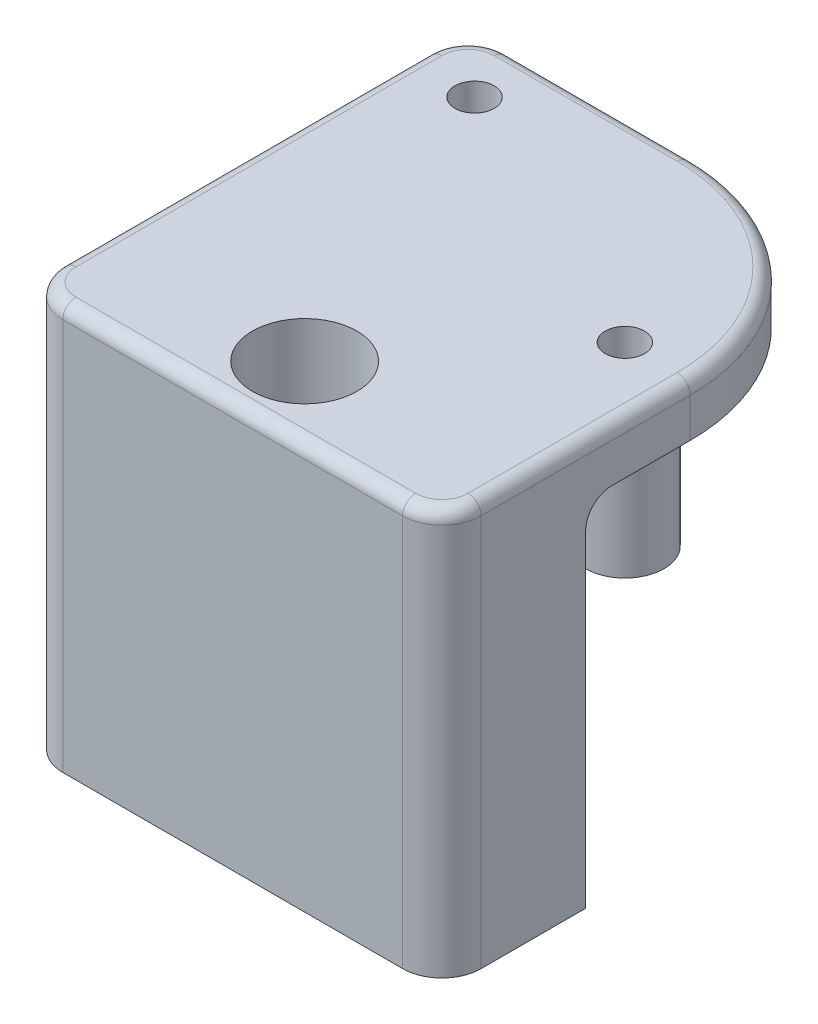
ISO-10303-21;
HEADER;
FILE_DESCRIPTION(('STEP AP214'),'2;1');
FILE_NAME('part.step','',(''),(''),'','','');
FILE_SCHEMA(('AUTOMOTIVE_DESIGN { 1 0 10303 214 1 1 1 1 }'));
ENDSEC;
DATA;
#1=APPLICATION_CONTEXT('core data for automotive mechanical design processes');
#2=APPLICATION_PROTOCOL_DEFINITION('international standard','automotive_design',2000,#1);
#3=PRODUCT_CONTEXT('',#1,'mechanical');
#4=PRODUCT('Part','Part','',(#3));
#5=PRODUCT_RELATED_PRODUCT_CATEGORY('part','',(#4));
#6=PRODUCT_DEFINITION_FORMATION('','',#4);
#7=PRODUCT_DEFINITION_CONTEXT('part definition',#1,'design');
#8=PRODUCT_DEFINITION('design','',#6,#7);
#9=PRODUCT_DEFINITION_SHAPE('','',#8);
#10=(LENGTH_UNIT() NAMED_UNIT(*) SI_UNIT(.MILLI.,.METRE.));
#11=(NAMED_UNIT(*) PLANE_ANGLE_UNIT() SI_UNIT($,.RADIAN.));
#12=(NAMED_UNIT(*) SI_UNIT($,.STERADIAN.) SOLID_ANGLE_UNIT());
#13=UNCERTAINTY_MEASURE_WITH_UNIT(LENGTH_MEASURE(1.E-05),#10,'distance_accuracy_value','');
#14=(GEOMETRIC_REPRESENTATION_CONTEXT(3) GLOBAL_UNCERTAINTY_ASSIGNED_CONTEXT((#13)) GLOBAL_UNIT_ASSIGNED_CONTEXT((#10,
#11,#12)) REPRESENTATION_CONTEXT('',''));
#15=CARTESIAN_POINT('',(0.,0.,0.));
#16=DIRECTION('',(0.,0.,1.));
#17=DIRECTION('',(1.,0.,0.));
#18=AXIS2_PLACEMENT_3D('',#15,#16,#17);
#19=CARTESIAN_POINT('',(17.,27.,-19.));
#20=DIRECTION('',(0.,-1.,0.));
#21=DIRECTION('',(0.,0.,-1.));
#22=AXIS2_PLACEMENT_3D('',#19,#20,#21);
#23=PLANE('',#22);
#24=DIRECTION('',(0.,0.,-1.));
#25=VECTOR('',#24,1.);
#26=CARTESIAN_POINT('',(32.,27.,0.));
#27=LINE('',#26,#25);
#28=CARTESIAN_POINT('',(32.,27.,-13.));
#29=VERTEX_POINT('',#28);
#30=CARTESIAN_POINT('',(32.,27.,-18.9999999999999));
#31=VERTEX_POINT('',#30);
#32=EDGE_CURVE('E195',#29,#31,#27,.T.);
#33=ORIENTED_EDGE('',*,*,#32,.F.);
#34=DIRECTION('',(-1.,0.,0.));
#35=VECTOR('',#34,1.);
#36=CARTESIAN_POINT('',(17.,27.,-13.));
#37=LINE('',#36,#35);
#38=CARTESIAN_POINT('',(0.,27.,-13.));
#39=VERTEX_POINT('',#38);
#40=EDGE_CURVE('E248',#29,#39,#37,.T.);
#41=ORIENTED_EDGE('',*,*,#40,.T.);
#42=DIRECTION('',(0.,0.,1.));
#43=VECTOR('',#42,1.);
#44=CARTESIAN_POINT('',(0.,27.,0.));
#45=LINE('',#44,#43);
#46=CARTESIAN_POINT('',(0.,27.,-31.));
#47=VERTEX_POINT('',#46);
#48=EDGE_CURVE('E191',#47,#39,#45,.T.);
#49=ORIENTED_EDGE('',*,*,#48,.F.);
#50=CARTESIAN_POINT('',(3.,27.,-31.));
#51=DIRECTION('',(0.,1.,0.));
#52=DIRECTION('',(0.,0.,1.));
#53=AXIS2_PLACEMENT_3D('',#50,#51,#52);
#54=CIRCLE('',#53,3.);
#55=CARTESIAN_POINT('',(3.,27.,-34.));
#56=VERTEX_POINT('',#55);
#57=EDGE_CURVE('E173',#56,#47,#54,.T.);
#58=ORIENTED_EDGE('',*,*,#57,.F.);
#59=DIRECTION('',(-1.,0.,0.));
#60=VECTOR('',#59,1.);
#61=CARTESIAN_POINT('',(16.9999999999999,27.,-34.));
#62=LINE('',#61,#60);
#63=CARTESIAN_POINT('',(16.9999999999999,27.,-34.));
#64=VERTEX_POINT('',#63);
#65=EDGE_CURVE('E155',#64,#56,#62,.T.);
#66=ORIENTED_EDGE('',*,*,#65,.F.);
#67=CARTESIAN_POINT('',(17.,27.,-19.));
#68=DIRECTION('',(0.,1.,0.));
#69=DIRECTION('',(0.,0.,-1.));
#70=AXIS2_PLACEMENT_3D('',#67,#68,#69);
#71=CIRCLE('',#70,15.);
#72=EDGE_CURVE('E170',#31,#64,#71,.T.);
#73=ORIENTED_EDGE('',*,*,#72,.F.);
#74=EDGE_LOOP('',(#33,#41,#49,#58,#66,#73));
#75=FACE_BOUND('',#74,.T.);
#76=CARTESIAN_POINT('',(5.,27.,-29.5));
#77=DIRECTION('',(0.,1.,0.));
#78=DIRECTION('',(0.,0.,1.));
#79=AXIS2_PLACEMENT_3D('',#76,#77,#78);
#80=CIRCLE('',#79,1.5);
#81=CARTESIAN_POINT('',(5.,27.,-28.));
#82=VERTEX_POINT('',#81);
#83=EDGE_CURVE('E185',#82,#82,#80,.T.);
#84=ORIENTED_EDGE('',*,*,#83,.T.);
#85=EDGE_LOOP('',(#84));
#86=FACE_BOUND('',#85,.T.);
#87=CARTESIAN_POINT('',(27.,27.,-19.));
#88=DIRECTION('',(0.,-1.,0.));
#89=DIRECTION('',(0.,0.,-1.));
#90=AXIS2_PLACEMENT_3D('',#87,#88,#89);
#91=CIRCLE('',#90,3.);
#92=CARTESIAN_POINT('',(27.,27.,-22.));
#93=VERTEX_POINT('',#92);
#94=EDGE_CURVE('E351',#93,#93,#91,.T.);
#95=ORIENTED_EDGE('',*,*,#94,.F.);
#96=EDGE_LOOP('',(#95));
#97=FACE_BOUND('',#96,.T.);
#98=ADVANCED_FACE('F41',(#75,#86,#97),#23,.T.);
#99=CARTESIAN_POINT('',(0.,0.,0.));
#100=DIRECTION('',(0.,-1.,0.));
#101=DIRECTION('',(0.,0.,-1.));
#102=AXIS2_PLACEMENT_3D('',#99,#100,#101);
#103=PLANE('',#102);
#104=DIRECTION('',(1.,0.,0.));
#105=VECTOR('',#104,1.);
#106=CARTESIAN_POINT('',(0.,0.,0.));
#107=LINE('',#106,#105);
#108=CARTESIAN_POINT('',(3.,0.,0.));
#109=VERTEX_POINT('',#108);
#110=CARTESIAN_POINT('',(29.,0.,0.));
#111=VERTEX_POINT('',#110);
#112=EDGE_CURVE('E212',#109,#111,#107,.T.);
#113=ORIENTED_EDGE('',*,*,#112,.F.);
#114=CARTESIAN_POINT('',(3.,0.,-3.));
#115=DIRECTION('',(0.,-1.,0.));
#116=DIRECTION('',(0.,0.,-1.));
#117=AXIS2_PLACEMENT_3D('',#114,#115,#116);
#118=CIRCLE('',#117,3.);
#119=CARTESIAN_POINT('',(0.,0.,-3.));
#120=VERTEX_POINT('',#119);
#121=EDGE_CURVE('E242',#109,#120,#118,.T.);
#122=ORIENTED_EDGE('',*,*,#121,.T.);
#123=DIRECTION('',(0.,0.,1.));
#124=VECTOR('',#123,1.);
#125=CARTESIAN_POINT('',(0.,0.,0.));
#126=LINE('',#125,#124);
#127=CARTESIAN_POINT('',(0.,0.,-11.));
#128=VERTEX_POINT('',#127);
#129=EDGE_CURVE('E208',#128,#120,#126,.T.);
#130=ORIENTED_EDGE('',*,*,#129,.F.);
#131=DIRECTION('',(-1.,0.,0.));
#132=VECTOR('',#131,1.);
#133=CARTESIAN_POINT('',(0.,0.,-11.));
#134=LINE('',#133,#132);
#135=CARTESIAN_POINT('',(32.,0.,-11.));
#136=VERTEX_POINT('',#135);
#137=EDGE_CURVE('E219',#136,#128,#134,.T.);
#138=ORIENTED_EDGE('',*,*,#137,.F.);
#139=DIRECTION('',(0.,0.,-1.));
#140=VECTOR('',#139,1.);
#141=CARTESIAN_POINT('',(32.,0.,0.));
#142=LINE('',#141,#140);
#143=CARTESIAN_POINT('',(32.,0.,-3.));
#144=VERTEX_POINT('',#143);
#145=EDGE_CURVE('E215',#144,#136,#142,.T.);
#146=ORIENTED_EDGE('',*,*,#145,.F.);
#147=CARTESIAN_POINT('',(29.,0.,-3.));
#148=DIRECTION('',(0.,-1.,0.));
#149=DIRECTION('',(0.,0.,-1.));
#150=AXIS2_PLACEMENT_3D('',#147,#148,#149);
#151=CIRCLE('',#150,3.);
#152=EDGE_CURVE('E232',#144,#111,#151,.T.);
#153=ORIENTED_EDGE('',*,*,#152,.T.);
#154=EDGE_LOOP('',(#113,#122,#130,#138,#146,#153));
#155=FACE_BOUND('',#154,.T.);
#156=CARTESIAN_POINT('',(16.,0.,-5.50000000000001));
#157=DIRECTION('',(0.,1.,0.));
#158=DIRECTION('',(0.,0.,1.));
#159=AXIS2_PLACEMENT_3D('',#156,#157,#158);
#160=CIRCLE('',#159,1.6);
#161=CARTESIAN_POINT('',(16.,0.,-3.9));
#162=VERTEX_POINT('',#161);
#163=EDGE_CURVE('E163',#162,#162,#160,.T.);
#164=ORIENTED_EDGE('',*,*,#163,.T.);
#165=EDGE_LOOP('',(#164));
#166=FACE_BOUND('',#165,.T.);
#167=ADVANCED_FACE('F391',(#155,#166),#103,.T.);
#168=CARTESIAN_POINT('',(0.,27.,0.));
#169=DIRECTION('',(1.,0.,0.));
#170=DIRECTION('',(0.,0.,-1.));
#171=AXIS2_PLACEMENT_3D('',#168,#169,#170);
#172=PLANE('',#171);
#173=DIRECTION('',(0.,-1.,0.));
#174=VECTOR('',#173,1.);
#175=CARTESIAN_POINT('',(0.,27.,-3.));
#176=LINE('',#175,#174);
#177=CARTESIAN_POINT('',(0.,30.,-3.));
#178=VERTEX_POINT('',#177);
#179=EDGE_CURVE('E245',#120,#178,#176,.F.);
#180=ORIENTED_EDGE('',*,*,#179,.T.);
#181=DIRECTION('',(0.,0.,1.));
#182=VECTOR('',#181,1.);
#183=CARTESIAN_POINT('',(0.,30.,0.));
#184=LINE('',#183,#182);
#185=CARTESIAN_POINT('',(0.,30.,-31.));
#186=VERTEX_POINT('',#185);
#187=EDGE_CURVE('E11',#178,#186,#184,.F.);
#188=ORIENTED_EDGE('',*,*,#187,.T.);
#189=DIRECTION('',(0.,-1.,0.));
#190=VECTOR('',#189,1.);
#191=CARTESIAN_POINT('',(0.,31.,-31.));
#192=LINE('',#191,#190);
#193=EDGE_CURVE('E200',#186,#47,#192,.T.);
#194=ORIENTED_EDGE('',*,*,#193,.T.);
#195=ORIENTED_EDGE('',*,*,#48,.T.);
#196=CARTESIAN_POINT('',(0.,25.,-13.));
#197=DIRECTION('',(1.,0.,0.));
#198=DIRECTION('',(0.,0.,-1.));
#199=AXIS2_PLACEMENT_3D('',#196,#197,#198);
#200=CIRCLE('',#199,2.);
#201=CARTESIAN_POINT('',(0.,25.,-11.));
#202=VERTEX_POINT('',#201);
#203=EDGE_CURVE('E265',#39,#202,#200,.T.);
#204=ORIENTED_EDGE('',*,*,#203,.T.);
#205=DIRECTION('',(0.,-1.,0.));
#206=VECTOR('',#205,1.);
#207=CARTESIAN_POINT('',(0.,27.,-11.));
#208=LINE('',#207,#206);
#209=EDGE_CURVE('E223',#202,#128,#208,.T.);
#210=ORIENTED_EDGE('',*,*,#209,.T.);
#211=ORIENTED_EDGE('',*,*,#129,.T.);
#212=EDGE_LOOP('',(#180,#188,#194,#195,#204,#210,#211));
#213=FACE_BOUND('',#212,.T.);
#214=ADVANCED_FACE('F396',(#213),#172,.F.);
#215=CARTESIAN_POINT('',(0.,27.,0.));
#216=DIRECTION('',(0.,0.,-1.));
#217=DIRECTION('',(-1.,0.,0.));
#218=AXIS2_PLACEMENT_3D('',#215,#216,#217);
#219=PLANE('',#218);
#220=DIRECTION('',(0.,-1.,0.));
#221=VECTOR('',#220,1.);
#222=CARTESIAN_POINT('',(29.,27.,0.));
#223=LINE('',#222,#221);
#224=CARTESIAN_POINT('',(29.,30.,0.));
#225=VERTEX_POINT('',#224);
#226=EDGE_CURVE('E236',#111,#225,#223,.F.);
#227=ORIENTED_EDGE('',*,*,#226,.T.);
#228=DIRECTION('',(1.,0.,0.));
#229=VECTOR('',#228,1.);
#230=CARTESIAN_POINT('',(0.,30.,0.));
#231=LINE('',#230,#229);
#232=CARTESIAN_POINT('',(3.,30.,0.));
#233=VERTEX_POINT('',#232);
#234=EDGE_CURVE('E66',#225,#233,#231,.F.);
#235=ORIENTED_EDGE('',*,*,#234,.T.);
#236=DIRECTION('',(0.,-1.,0.));
#237=VECTOR('',#236,1.);
#238=CARTESIAN_POINT('',(3.,27.,0.));
#239=LINE('',#238,#237);
#240=EDGE_CURVE('E239',#233,#109,#239,.T.);
#241=ORIENTED_EDGE('',*,*,#240,.T.);
#242=ORIENTED_EDGE('',*,*,#112,.T.);
#243=EDGE_LOOP('',(#227,#235,#241,#242));
#244=FACE_BOUND('',#243,.T.);
#245=ADVANCED_FACE('F416',(#244),#219,.F.);
#246=CARTESIAN_POINT('',(32.,27.,0.));
#247=DIRECTION('',(-1.,0.,0.));
#248=DIRECTION('',(0.,0.,1.));
#249=AXIS2_PLACEMENT_3D('',#246,#247,#248);
#250=PLANE('',#249);
#251=DIRECTION('',(0.,-1.,0.));
#252=VECTOR('',#251,1.);
#253=CARTESIAN_POINT('',(32.,31.,-18.9999999999999));
#254=LINE('',#253,#252);
#255=CARTESIAN_POINT('',(32.,30.,-18.9999999999999));
#256=VERTEX_POINT('',#255);
#257=EDGE_CURVE('E178',#256,#31,#254,.T.);
#258=ORIENTED_EDGE('',*,*,#257,.F.);
#259=DIRECTION('',(0.,0.,-1.));
#260=VECTOR('',#259,1.);
#261=CARTESIAN_POINT('',(32.,30.,0.));
#262=LINE('',#261,#260);
#263=CARTESIAN_POINT('',(32.,30.,-3.));
#264=VERTEX_POINT('',#263);
#265=EDGE_CURVE('E305',#256,#264,#262,.F.);
#266=ORIENTED_EDGE('',*,*,#265,.T.);
#267=DIRECTION('',(0.,-1.,0.));
#268=VECTOR('',#267,1.);
#269=CARTESIAN_POINT('',(32.,27.,-3.));
#270=LINE('',#269,#268);
#271=EDGE_CURVE('E229',#264,#144,#270,.T.);
#272=ORIENTED_EDGE('',*,*,#271,.T.);
#273=ORIENTED_EDGE('',*,*,#145,.T.);
#274=DIRECTION('',(0.,-1.,0.));
#275=VECTOR('',#274,1.);
#276=CARTESIAN_POINT('',(32.,27.,-11.));
#277=LINE('',#276,#275);
#278=CARTESIAN_POINT('',(32.,25.,-11.));
#279=VERTEX_POINT('',#278);
#280=EDGE_CURVE('E226',#279,#136,#277,.T.);
#281=ORIENTED_EDGE('',*,*,#280,.F.);
#282=CARTESIAN_POINT('',(32.,25.,-13.));
#283=DIRECTION('',(-1.,0.,0.));
#284=DIRECTION('',(0.,0.,1.));
#285=AXIS2_PLACEMENT_3D('',#282,#283,#284);
#286=CIRCLE('',#285,2.);
#287=EDGE_CURVE('E268',#279,#29,#286,.T.);
#288=ORIENTED_EDGE('',*,*,#287,.T.);
#289=ORIENTED_EDGE('',*,*,#32,.T.);
#290=EDGE_LOOP('',(#258,#266,#272,#273,#281,#288,#289));
#291=FACE_BOUND('',#290,.T.);
#292=ADVANCED_FACE('F412',(#291),#250,.F.);
#293=CARTESIAN_POINT('',(0.,27.,-11.));
#294=DIRECTION('',(0.,0.,1.));
#295=DIRECTION('',(1.,0.,0.));
#296=AXIS2_PLACEMENT_3D('',#293,#294,#295);
#297=PLANE('',#296);
#298=ORIENTED_EDGE('',*,*,#209,.F.);
#299=DIRECTION('',(-1.,0.,0.));
#300=VECTOR('',#299,1.);
#301=CARTESIAN_POINT('',(0.,25.,-11.));
#302=LINE('',#301,#300);
#303=EDGE_CURVE('E262',#202,#279,#302,.F.);
#304=ORIENTED_EDGE('',*,*,#303,.T.);
#305=ORIENTED_EDGE('',*,*,#280,.T.);
#306=ORIENTED_EDGE('',*,*,#137,.T.);
#307=EDGE_LOOP('',(#298,#304,#305,#306));
#308=FACE_BOUND('',#307,.T.);
#309=ADVANCED_FACE('F407',(#308),#297,.F.);
#310=CARTESIAN_POINT('',(16.,27.,-5.50000000000001));
#311=DIRECTION('',(0.,-1.,0.));
#312=DIRECTION('',(0.,0.,-1.));
#313=AXIS2_PLACEMENT_3D('',#310,#311,#312);
#314=CYLINDRICAL_SURFACE('',#313,1.6);
#315=CARTESIAN_POINT('',(16.,17.,-5.50000000000001));
#316=DIRECTION('',(0.,-1.,0.));
#317=DIRECTION('',(0.,0.,-1.));
#318=AXIS2_PLACEMENT_3D('',#315,#316,#317);
#319=CIRCLE('',#318,1.6);
#320=CARTESIAN_POINT('',(16.,17.,-7.10000000000001));
#321=VERTEX_POINT('',#320);
#322=EDGE_CURVE('E253',#321,#321,#319,.T.);
#323=ORIENTED_EDGE('',*,*,#322,.F.);
#324=EDGE_LOOP('',(#323));
#325=FACE_BOUND('',#324,.T.);
#326=ORIENTED_EDGE('',*,*,#163,.F.);
#327=EDGE_LOOP('',(#326));
#328=FACE_BOUND('',#327,.T.);
#329=ADVANCED_FACE('F405',(#325,#328),#314,.F.);
#330=CARTESIAN_POINT('',(17.,31.,-19.));
#331=DIRECTION('',(0.,-1.,0.));
#332=DIRECTION('',(0.,0.,-1.));
#333=AXIS2_PLACEMENT_3D('',#330,#331,#332);
#334=PLANE('',#333);
#335=DIRECTION('',(-1.,0.,0.));
#336=VECTOR('',#335,1.);
#337=CARTESIAN_POINT('',(17.,31.,-33.));
#338=LINE('',#337,#336);
#339=CARTESIAN_POINT('',(16.9999999999999,31.,-33.));
#340=VERTEX_POINT('',#339);
#341=CARTESIAN_POINT('',(3.,31.,-33.));
#342=VERTEX_POINT('',#341);
#343=EDGE_CURVE('E289',#340,#342,#338,.T.);
#344=ORIENTED_EDGE('',*,*,#343,.T.);
#345=CARTESIAN_POINT('',(3.,31.,-31.));
#346=DIRECTION('',(0.,-1.,0.));
#347=DIRECTION('',(0.,0.,-1.));
#348=AXIS2_PLACEMENT_3D('',#345,#346,#347);
#349=CIRCLE('',#348,2.);
#350=CARTESIAN_POINT('',(1.,31.,-31.));
#351=VERTEX_POINT('',#350);
#352=EDGE_CURVE('E292',#342,#351,#349,.F.);
#353=ORIENTED_EDGE('',*,*,#352,.T.);
#354=DIRECTION('',(0.,0.,1.));
#355=VECTOR('',#354,1.);
#356=CARTESIAN_POINT('',(1.,31.,-19.));
#357=LINE('',#356,#355);
#358=CARTESIAN_POINT('',(1.,31.,-3.));
#359=VERTEX_POINT('',#358);
#360=EDGE_CURVE('E271',#351,#359,#357,.T.);
#361=ORIENTED_EDGE('',*,*,#360,.T.);
#362=CARTESIAN_POINT('',(3.,31.,-3.));
#363=DIRECTION('',(0.,-1.,0.));
#364=DIRECTION('',(0.,0.,-1.));
#365=AXIS2_PLACEMENT_3D('',#362,#363,#364);
#366=CIRCLE('',#365,2.);
#367=CARTESIAN_POINT('',(3.,31.,-1.));
#368=VERTEX_POINT('',#367);
#369=EDGE_CURVE('E274',#359,#368,#366,.F.);
#370=ORIENTED_EDGE('',*,*,#369,.T.);
#371=DIRECTION('',(1.,0.,0.));
#372=VECTOR('',#371,1.);
#373=CARTESIAN_POINT('',(17.,31.,-1.));
#374=LINE('',#373,#372);
#375=CARTESIAN_POINT('',(29.,31.,-1.00000000000001));
#376=VERTEX_POINT('',#375);
#377=EDGE_CURVE('E277',#368,#376,#374,.T.);
#378=ORIENTED_EDGE('',*,*,#377,.T.);
#379=CARTESIAN_POINT('',(29.,31.,-3.));
#380=DIRECTION('',(0.,-1.,0.));
#381=DIRECTION('',(0.,0.,-1.));
#382=AXIS2_PLACEMENT_3D('',#379,#380,#381);
#383=CIRCLE('',#382,2.);
#384=CARTESIAN_POINT('',(31.,31.,-3.));
#385=VERTEX_POINT('',#384);
#386=EDGE_CURVE('E280',#376,#385,#383,.F.);
#387=ORIENTED_EDGE('',*,*,#386,.T.);
#388=DIRECTION('',(0.,0.,-1.));
#389=VECTOR('',#388,1.);
#390=CARTESIAN_POINT('',(31.,31.,-19.));
#391=LINE('',#390,#389);
#392=CARTESIAN_POINT('',(31.,31.,-18.9999999999999));
#393=VERTEX_POINT('',#392);
#394=EDGE_CURVE('E283',#385,#393,#391,.T.);
#395=ORIENTED_EDGE('',*,*,#394,.T.);
#396=CARTESIAN_POINT('',(17.,31.,-19.));
#397=DIRECTION('',(0.,-1.,0.));
#398=DIRECTION('',(0.,0.,-1.));
#399=AXIS2_PLACEMENT_3D('',#396,#397,#398);
#400=CIRCLE('',#399,14.);
#401=EDGE_CURVE('E286',#393,#340,#400,.F.);
#402=ORIENTED_EDGE('',*,*,#401,.T.);
#403=EDGE_LOOP('',(#344,#353,#361,#370,#378,#387,#395,#402));
#404=FACE_BOUND('',#403,.T.);
#405=CARTESIAN_POINT('',(16.,31.,-5.50000000000001));
#406=DIRECTION('',(0.,-1.,0.));
#407=DIRECTION('',(0.,0.,-1.));
#408=AXIS2_PLACEMENT_3D('',#405,#406,#407);
#409=CIRCLE('',#408,4.);
#410=CARTESIAN_POINT('',(16.,31.,-9.50000000000001));
#411=VERTEX_POINT('',#410);
#412=EDGE_CURVE('E249',#411,#411,#409,.T.);
#413=ORIENTED_EDGE('',*,*,#412,.T.);
#414=EDGE_LOOP('',(#413));
#415=FACE_BOUND('',#414,.T.);
#416=CARTESIAN_POINT('',(5.,31.,-29.5));
#417=DIRECTION('',(0.,1.,0.));
#418=DIRECTION('',(0.,0.,1.));
#419=AXIS2_PLACEMENT_3D('',#416,#417,#418);
#420=CIRCLE('',#419,1.5);
#421=CARTESIAN_POINT('',(5.,31.,-28.));
#422=VERTEX_POINT('',#421);
#423=EDGE_CURVE('E181',#422,#422,#420,.T.);
#424=ORIENTED_EDGE('',*,*,#423,.F.);
#425=EDGE_LOOP('',(#424));
#426=FACE_BOUND('',#425,.T.);
#427=CARTESIAN_POINT('',(27.,31.,-19.));
#428=DIRECTION('',(0.,1.,0.));
#429=DIRECTION('',(0.,0.,1.));
#430=AXIS2_PLACEMENT_3D('',#427,#428,#429);
#431=CIRCLE('',#430,1.5);
#432=CARTESIAN_POINT('',(27.,31.,-17.5));
#433=VERTEX_POINT('',#432);
#434=EDGE_CURVE('E258',#433,#433,#431,.T.);
#435=ORIENTED_EDGE('',*,*,#434,.F.);
#436=EDGE_LOOP('',(#435));
#437=FACE_BOUND('',#436,.T.);
#438=ADVANCED_FACE('F399',(#404,#415,#426,#437),#334,.F.);
#439=CARTESIAN_POINT('',(17.,31.,-19.));
#440=DIRECTION('',(0.,-1.,0.));
#441=DIRECTION('',(0.,0.,-1.));
#442=AXIS2_PLACEMENT_3D('',#439,#440,#441);
#443=CYLINDRICAL_SURFACE('',#442,15.);
#444=DIRECTION('',(0.,-1.,0.));
#445=VECTOR('',#444,1.);
#446=CARTESIAN_POINT('',(16.9999999999999,31.,-34.));
#447=LINE('',#446,#445);
#448=CARTESIAN_POINT('',(16.9999999999999,30.,-34.));
#449=VERTEX_POINT('',#448);
#450=EDGE_CURVE('E151',#449,#64,#447,.T.);
#451=ORIENTED_EDGE('',*,*,#450,.F.);
#452=CARTESIAN_POINT('',(17.,30.,-19.));
#453=DIRECTION('',(0.,-1.,0.));
#454=DIRECTION('',(0.,0.,-1.));
#455=AXIS2_PLACEMENT_3D('',#452,#453,#454);
#456=CIRCLE('',#455,15.);
#457=EDGE_CURVE('E302',#449,#256,#456,.T.);
#458=ORIENTED_EDGE('',*,*,#457,.T.);
#459=ORIENTED_EDGE('',*,*,#257,.T.);
#460=ORIENTED_EDGE('',*,*,#72,.T.);
#461=EDGE_LOOP('',(#451,#458,#459,#460));
#462=FACE_BOUND('',#461,.T.);
#463=ADVANCED_FACE('F176',(#462),#443,.T.);
#464=CARTESIAN_POINT('',(16.9999999999999,31.,-34.));
#465=DIRECTION('',(0.,0.,1.));
#466=DIRECTION('',(1.,0.,0.));
#467=AXIS2_PLACEMENT_3D('',#464,#465,#466);
#468=PLANE('',#467);
#469=DIRECTION('',(0.,-1.,0.));
#470=VECTOR('',#469,1.);
#471=CARTESIAN_POINT('',(3.,31.,-34.));
#472=LINE('',#471,#470);
#473=CARTESIAN_POINT('',(3.,30.,-34.));
#474=VERTEX_POINT('',#473);
#475=EDGE_CURVE('E164',#474,#56,#472,.T.);
#476=ORIENTED_EDGE('',*,*,#475,.F.);
#477=DIRECTION('',(-1.,0.,0.));
#478=VECTOR('',#477,1.);
#479=CARTESIAN_POINT('',(16.9999999999999,30.,-34.));
#480=LINE('',#479,#478);
#481=EDGE_CURVE('E158',#474,#449,#480,.F.);
#482=ORIENTED_EDGE('',*,*,#481,.T.);
#483=ORIENTED_EDGE('',*,*,#450,.T.);
#484=ORIENTED_EDGE('',*,*,#65,.T.);
#485=EDGE_LOOP('',(#476,#482,#483,#484));
#486=FACE_BOUND('',#485,.T.);
#487=ADVANCED_FACE('F154',(#486),#468,.F.);
#488=CARTESIAN_POINT('',(3.,31.,-31.));
#489=DIRECTION('',(0.,-1.,0.));
#490=DIRECTION('',(0.,0.,-1.));
#491=AXIS2_PLACEMENT_3D('',#488,#489,#490);
#492=CYLINDRICAL_SURFACE('',#491,3.);
#493=ORIENTED_EDGE('',*,*,#193,.F.);
#494=CARTESIAN_POINT('',(3.,30.,-31.));
#495=DIRECTION('',(0.,-1.,0.));
#496=DIRECTION('',(0.,0.,-1.));
#497=AXIS2_PLACEMENT_3D('',#494,#495,#496);
#498=CIRCLE('',#497,3.);
#499=EDGE_CURVE('E296',#186,#474,#498,.T.);
#500=ORIENTED_EDGE('',*,*,#499,.T.);
#501=ORIENTED_EDGE('',*,*,#475,.T.);
#502=ORIENTED_EDGE('',*,*,#57,.T.);
#503=EDGE_LOOP('',(#493,#500,#501,#502));
#504=FACE_BOUND('',#503,.T.);
#505=ADVANCED_FACE('F378',(#504),#492,.T.);
#506=CARTESIAN_POINT('',(5.,31.,-29.5));
#507=DIRECTION('',(0.,-1.,0.));
#508=DIRECTION('',(0.,0.,-1.));
#509=AXIS2_PLACEMENT_3D('',#506,#507,#508);
#510=CYLINDRICAL_SURFACE('',#509,1.5);
#511=ORIENTED_EDGE('',*,*,#423,.T.);
#512=EDGE_LOOP('',(#511));
#513=FACE_BOUND('',#512,.T.);
#514=ORIENTED_EDGE('',*,*,#83,.F.);
#515=EDGE_LOOP('',(#514));
#516=FACE_BOUND('',#515,.T.);
#517=ADVANCED_FACE('F375',(#513,#516),#510,.F.);
#518=CARTESIAN_POINT('',(27.,31.,-19.));
#519=DIRECTION('',(0.,-1.,0.));
#520=DIRECTION('',(0.,0.,-1.));
#521=AXIS2_PLACEMENT_3D('',#518,#519,#520);
#522=CYLINDRICAL_SURFACE('',#521,1.5);
#523=ORIENTED_EDGE('',*,*,#434,.T.);
#524=EDGE_LOOP('',(#523));
#525=FACE_BOUND('',#524,.T.);
#526=CARTESIAN_POINT('',(27.,17.5,-19.));
#527=DIRECTION('',(0.,-1.,0.));
#528=DIRECTION('',(0.,0.,-1.));
#529=AXIS2_PLACEMENT_3D('',#526,#527,#528);
#530=CIRCLE('',#529,1.5);
#531=CARTESIAN_POINT('',(27.,17.5,-20.5));
#532=VERTEX_POINT('',#531);
#533=EDGE_CURVE('E344',#532,#532,#530,.T.);
#534=ORIENTED_EDGE('',*,*,#533,.T.);
#535=EDGE_LOOP('',(#534));
#536=FACE_BOUND('',#535,.T.);
#537=ADVANCED_FACE('F377',(#525,#536),#522,.F.);
#538=CARTESIAN_POINT('',(29.,27.,-3.));
#539=DIRECTION('',(0.,-1.,0.));
#540=DIRECTION('',(0.,0.,-1.));
#541=AXIS2_PLACEMENT_3D('',#538,#539,#540);
#542=CYLINDRICAL_SURFACE('',#541,3.);
#543=ORIENTED_EDGE('',*,*,#271,.F.);
#544=CARTESIAN_POINT('',(29.,30.,-3.));
#545=DIRECTION('',(0.,-1.,0.));
#546=DIRECTION('',(0.,0.,-1.));
#547=AXIS2_PLACEMENT_3D('',#544,#545,#546);
#548=CIRCLE('',#547,3.);
#549=EDGE_CURVE('E308',#264,#225,#548,.T.);
#550=ORIENTED_EDGE('',*,*,#549,.T.);
#551=ORIENTED_EDGE('',*,*,#226,.F.);
#552=ORIENTED_EDGE('',*,*,#152,.F.);
#553=EDGE_LOOP('',(#543,#550,#551,#552));
#554=FACE_BOUND('',#553,.T.);
#555=ADVANCED_FACE('F385',(#554),#542,.T.);
#556=CARTESIAN_POINT('',(3.,27.,-3.));
#557=DIRECTION('',(0.,-1.,0.));
#558=DIRECTION('',(0.,0.,-1.));
#559=AXIS2_PLACEMENT_3D('',#556,#557,#558);
#560=CYLINDRICAL_SURFACE('',#559,3.);
#561=ORIENTED_EDGE('',*,*,#240,.F.);
#562=CARTESIAN_POINT('',(3.,30.,-3.));
#563=DIRECTION('',(0.,-1.,0.));
#564=DIRECTION('',(0.,0.,-1.));
#565=AXIS2_PLACEMENT_3D('',#562,#563,#564);
#566=CIRCLE('',#565,3.);
#567=EDGE_CURVE('E51',#233,#178,#566,.T.);
#568=ORIENTED_EDGE('',*,*,#567,.T.);
#569=ORIENTED_EDGE('',*,*,#179,.F.);
#570=ORIENTED_EDGE('',*,*,#121,.F.);
#571=EDGE_LOOP('',(#561,#568,#569,#570));
#572=FACE_BOUND('',#571,.T.);
#573=ADVANCED_FACE('F425',(#572),#560,.T.);
#574=CARTESIAN_POINT('',(16.,32.,-5.50000000000001));
#575=DIRECTION('',(0.,-1.,0.));
#576=DIRECTION('',(0.,0.,-1.));
#577=AXIS2_PLACEMENT_3D('',#574,#575,#576);
#578=CYLINDRICAL_SURFACE('',#577,4.);
#579=CARTESIAN_POINT('',(16.,17.,-5.50000000000001));
#580=DIRECTION('',(0.,-1.,0.));
#581=DIRECTION('',(0.,0.,-1.));
#582=AXIS2_PLACEMENT_3D('',#579,#580,#581);
#583=CIRCLE('',#582,4.);
#584=CARTESIAN_POINT('',(16.,17.,-9.50000000000001));
#585=VERTEX_POINT('',#584);
#586=EDGE_CURVE('E254',#585,#585,#583,.T.);
#587=ORIENTED_EDGE('',*,*,#586,.T.);
#588=EDGE_LOOP('',(#587));
#589=FACE_BOUND('',#588,.T.);
#590=ORIENTED_EDGE('',*,*,#412,.F.);
#591=EDGE_LOOP('',(#590));
#592=FACE_BOUND('',#591,.T.);
#593=ADVANCED_FACE('F429',(#589,#592),#578,.F.);
#594=CARTESIAN_POINT('',(16.,17.,-5.50000000000001));
#595=DIRECTION('',(0.,-1.,0.));
#596=DIRECTION('',(0.,0.,-1.));
#597=AXIS2_PLACEMENT_3D('',#594,#595,#596);
#598=PLANE('',#597);
#599=ORIENTED_EDGE('',*,*,#322,.T.);
#600=EDGE_LOOP('',(#599));
#601=FACE_BOUND('',#600,.T.);
#602=ORIENTED_EDGE('',*,*,#586,.F.);
#603=EDGE_LOOP('',(#602));
#604=FACE_BOUND('',#603,.T.);
#605=ADVANCED_FACE('F434',(#601,#604),#598,.F.);
#606=CARTESIAN_POINT('',(17.,25.,-13.));
#607=DIRECTION('',(-1.,0.,0.));
#608=DIRECTION('',(0.,0.,1.));
#609=AXIS2_PLACEMENT_3D('',#606,#607,#608);
#610=CYLINDRICAL_SURFACE('',#609,2.);
#611=ORIENTED_EDGE('',*,*,#287,.F.);
#612=ORIENTED_EDGE('',*,*,#303,.F.);
#613=ORIENTED_EDGE('',*,*,#203,.F.);
#614=ORIENTED_EDGE('',*,*,#40,.F.);
#615=EDGE_LOOP('',(#611,#612,#613,#614));
#616=FACE_BOUND('',#615,.T.);
#617=ADVANCED_FACE('F430',(#616),#610,.F.);
#618=CARTESIAN_POINT('',(27.,17.5,-19.));
#619=DIRECTION('',(0.,-1.,0.));
#620=DIRECTION('',(0.,0.,-1.));
#621=AXIS2_PLACEMENT_3D('',#618,#619,#620);
#622=PLANE('',#621);
#623=CARTESIAN_POINT('',(27.,17.5,-19.));
#624=DIRECTION('',(0.,-1.,0.));
#625=DIRECTION('',(0.,0.,-1.));
#626=AXIS2_PLACEMENT_3D('',#623,#624,#625);
#627=CIRCLE('',#626,3.);
#628=CARTESIAN_POINT('',(27.,17.5,-22.));
#629=VERTEX_POINT('',#628);
#630=EDGE_CURVE('E357',#629,#629,#627,.T.);
#631=ORIENTED_EDGE('',*,*,#630,.T.);
#632=EDGE_LOOP('',(#631));
#633=FACE_BOUND('',#632,.T.);
#634=ORIENTED_EDGE('',*,*,#533,.F.);
#635=EDGE_LOOP('',(#634));
#636=FACE_BOUND('',#635,.T.);
#637=ADVANCED_FACE('F433',(#633,#636),#622,.T.);
#638=CARTESIAN_POINT('',(27.,17.5,-19.));
#639=DIRECTION('',(0.,1.,0.));
#640=DIRECTION('',(0.,0.,1.));
#641=AXIS2_PLACEMENT_3D('',#638,#639,#640);
#642=CYLINDRICAL_SURFACE('',#641,3.);
#643=ORIENTED_EDGE('',*,*,#630,.F.);
#644=EDGE_LOOP('',(#643));
#645=FACE_BOUND('',#644,.T.);
#646=ORIENTED_EDGE('',*,*,#94,.T.);
#647=EDGE_LOOP('',(#646));
#648=FACE_BOUND('',#647,.T.);
#649=ADVANCED_FACE('F463',(#645,#648),#642,.T.);
#650=CARTESIAN_POINT('',(29.,30.,-3.));
#651=DIRECTION('',(0.,-1.,0.));
#652=DIRECTION('',(0.,0.,-1.));
#653=AXIS2_PLACEMENT_3D('',#650,#651,#652);
#654=TOROIDAL_SURFACE('',#653,2.,1.);
#655=CARTESIAN_POINT('',(29.,30.,-1.));
#656=DIRECTION('',(-1.,0.,0.));
#657=DIRECTION('',(0.,0.,1.));
#658=AXIS2_PLACEMENT_3D('',#655,#656,#657);
#659=CIRCLE('',#658,1.);
#660=EDGE_CURVE('E336',#225,#376,#659,.T.);
#661=ORIENTED_EDGE('',*,*,#660,.F.);
#662=ORIENTED_EDGE('',*,*,#549,.F.);
#663=CARTESIAN_POINT('',(31.,30.,-3.));
#664=DIRECTION('',(0.,0.,-1.));
#665=DIRECTION('',(-1.,0.,0.));
#666=AXIS2_PLACEMENT_3D('',#663,#664,#665);
#667=CIRCLE('',#666,1.);
#668=EDGE_CURVE('E45',#385,#264,#667,.T.);
#669=ORIENTED_EDGE('',*,*,#668,.F.);
#670=ORIENTED_EDGE('',*,*,#386,.F.);
#671=EDGE_LOOP('',(#661,#662,#669,#670));
#672=FACE_BOUND('',#671,.T.);
#673=ADVANCED_FACE('F43',(#672),#654,.T.);
#674=CARTESIAN_POINT('',(31.,30.,-19.));
#675=DIRECTION('',(0.,0.,-1.));
#676=DIRECTION('',(-1.,0.,0.));
#677=AXIS2_PLACEMENT_3D('',#674,#675,#676);
#678=CYLINDRICAL_SURFACE('',#677,1.);
#679=ORIENTED_EDGE('',*,*,#668,.T.);
#680=ORIENTED_EDGE('',*,*,#265,.F.);
#681=CARTESIAN_POINT('',(31.,30.,-18.9999999999999));
#682=DIRECTION('',(0.,0.,-1.));
#683=DIRECTION('',(-1.,0.,0.));
#684=AXIS2_PLACEMENT_3D('',#681,#682,#683);
#685=CIRCLE('',#684,1.);
#686=EDGE_CURVE('E333',#393,#256,#685,.T.);
#687=ORIENTED_EDGE('',*,*,#686,.F.);
#688=ORIENTED_EDGE('',*,*,#394,.F.);
#689=EDGE_LOOP('',(#679,#680,#687,#688));
#690=FACE_BOUND('',#689,.T.);
#691=ADVANCED_FACE('F458',(#690),#678,.T.);
#692=CARTESIAN_POINT('',(17.,30.,-1.));
#693=DIRECTION('',(1.,0.,0.));
#694=DIRECTION('',(0.,0.,-1.));
#695=AXIS2_PLACEMENT_3D('',#692,#693,#694);
#696=CYLINDRICAL_SURFACE('',#695,1.);
#697=ORIENTED_EDGE('',*,*,#660,.T.);
#698=ORIENTED_EDGE('',*,*,#377,.F.);
#699=CARTESIAN_POINT('',(3.,30.,-1.));
#700=DIRECTION('',(-1.,0.,0.));
#701=DIRECTION('',(0.,0.,1.));
#702=AXIS2_PLACEMENT_3D('',#699,#700,#701);
#703=CIRCLE('',#702,1.);
#704=EDGE_CURVE('E329',#233,#368,#703,.T.);
#705=ORIENTED_EDGE('',*,*,#704,.F.);
#706=ORIENTED_EDGE('',*,*,#234,.F.);
#707=EDGE_LOOP('',(#697,#698,#705,#706));
#708=FACE_BOUND('',#707,.T.);
#709=ADVANCED_FACE('F455',(#708),#696,.T.);
#710=CARTESIAN_POINT('',(17.,30.,-19.));
#711=DIRECTION('',(0.,-1.,0.));
#712=DIRECTION('',(0.,0.,-1.));
#713=AXIS2_PLACEMENT_3D('',#710,#711,#712);
#714=TOROIDAL_SURFACE('',#713,14.,1.);
#715=ORIENTED_EDGE('',*,*,#686,.T.);
#716=ORIENTED_EDGE('',*,*,#457,.F.);
#717=CARTESIAN_POINT('',(16.9999999999999,30.,-33.));
#718=DIRECTION('',(-1.,0.,0.));
#719=DIRECTION('',(0.,0.,1.));
#720=AXIS2_PLACEMENT_3D('',#717,#718,#719);
#721=CIRCLE('',#720,1.);
#722=EDGE_CURVE('E325',#340,#449,#721,.T.);
#723=ORIENTED_EDGE('',*,*,#722,.F.);
#724=ORIENTED_EDGE('',*,*,#401,.F.);
#725=EDGE_LOOP('',(#715,#716,#723,#724));
#726=FACE_BOUND('',#725,.T.);
#727=ADVANCED_FACE('F451',(#726),#714,.T.);
#728=CARTESIAN_POINT('',(3.,30.,-3.));
#729=DIRECTION('',(0.,-1.,0.));
#730=DIRECTION('',(0.,0.,-1.));
#731=AXIS2_PLACEMENT_3D('',#728,#729,#730);
#732=TOROIDAL_SURFACE('',#731,2.,1.);
#733=ORIENTED_EDGE('',*,*,#704,.T.);
#734=ORIENTED_EDGE('',*,*,#369,.F.);
#735=CARTESIAN_POINT('',(1.,30.,-3.));
#736=DIRECTION('',(0.,0.,-1.));
#737=DIRECTION('',(-1.,0.,0.));
#738=AXIS2_PLACEMENT_3D('',#735,#736,#737);
#739=CIRCLE('',#738,1.);
#740=EDGE_CURVE('E321',#178,#359,#739,.T.);
#741=ORIENTED_EDGE('',*,*,#740,.F.);
#742=ORIENTED_EDGE('',*,*,#567,.F.);
#743=EDGE_LOOP('',(#733,#734,#741,#742));
#744=FACE_BOUND('',#743,.T.);
#745=ADVANCED_FACE('F447',(#744),#732,.T.);
#746=CARTESIAN_POINT('',(17.,30.,-33.));
#747=DIRECTION('',(-1.,0.,0.));
#748=DIRECTION('',(0.,0.,1.));
#749=AXIS2_PLACEMENT_3D('',#746,#747,#748);
#750=CYLINDRICAL_SURFACE('',#749,1.);
#751=ORIENTED_EDGE('',*,*,#722,.T.);
#752=ORIENTED_EDGE('',*,*,#481,.F.);
#753=CARTESIAN_POINT('',(3.,30.,-33.));
#754=DIRECTION('',(-1.,0.,0.));
#755=DIRECTION('',(0.,0.,1.));
#756=AXIS2_PLACEMENT_3D('',#753,#754,#755);
#757=CIRCLE('',#756,1.);
#758=EDGE_CURVE('E318',#342,#474,#757,.T.);
#759=ORIENTED_EDGE('',*,*,#758,.F.);
#760=ORIENTED_EDGE('',*,*,#343,.F.);
#761=EDGE_LOOP('',(#751,#752,#759,#760));
#762=FACE_BOUND('',#761,.T.);
#763=ADVANCED_FACE('F443',(#762),#750,.T.);
#764=CARTESIAN_POINT('',(1.,30.,-19.));
#765=DIRECTION('',(0.,0.,1.));
#766=DIRECTION('',(1.,0.,0.));
#767=AXIS2_PLACEMENT_3D('',#764,#765,#766);
#768=CYLINDRICAL_SURFACE('',#767,1.);
#769=ORIENTED_EDGE('',*,*,#740,.T.);
#770=ORIENTED_EDGE('',*,*,#360,.F.);
#771=CARTESIAN_POINT('',(1.,30.,-31.));
#772=DIRECTION('',(0.,0.,-1.));
#773=DIRECTION('',(-1.,0.,0.));
#774=AXIS2_PLACEMENT_3D('',#771,#772,#773);
#775=CIRCLE('',#774,1.);
#776=EDGE_CURVE('E315',#186,#351,#775,.T.);
#777=ORIENTED_EDGE('',*,*,#776,.F.);
#778=ORIENTED_EDGE('',*,*,#187,.F.);
#779=EDGE_LOOP('',(#769,#770,#777,#778));
#780=FACE_BOUND('',#779,.T.);
#781=ADVANCED_FACE('F439',(#780),#768,.T.);
#782=CARTESIAN_POINT('',(3.,30.,-31.));
#783=DIRECTION('',(0.,-1.,0.));
#784=DIRECTION('',(0.,0.,-1.));
#785=AXIS2_PLACEMENT_3D('',#782,#783,#784);
#786=TOROIDAL_SURFACE('',#785,2.,1.);
#787=ORIENTED_EDGE('',*,*,#758,.T.);
#788=ORIENTED_EDGE('',*,*,#499,.F.);
#789=ORIENTED_EDGE('',*,*,#776,.T.);
#790=ORIENTED_EDGE('',*,*,#352,.F.);
#791=EDGE_LOOP('',(#787,#788,#789,#790));
#792=FACE_BOUND('',#791,.T.);
#793=ADVANCED_FACE('F436',(#792),#786,.T.);
#794=CLOSED_SHELL('',(#98,#167,#214,#245,#292,#309,#329,#438,#463,#487,#505,#517,#537,#555,#573,
#593,#605,#617,#637,#649,#673,#691,#709,#727,#745,#763,#781,#793));
#795=MANIFOLD_SOLID_BREP('B2',#794);
#796=ADVANCED_BREP_SHAPE_REPRESENTATION('',(#18,#795),#14);
#797=SHAPE_DEFINITION_REPRESENTATION(#9,#796);
ENDSEC;
END-ISO-10303-21;
